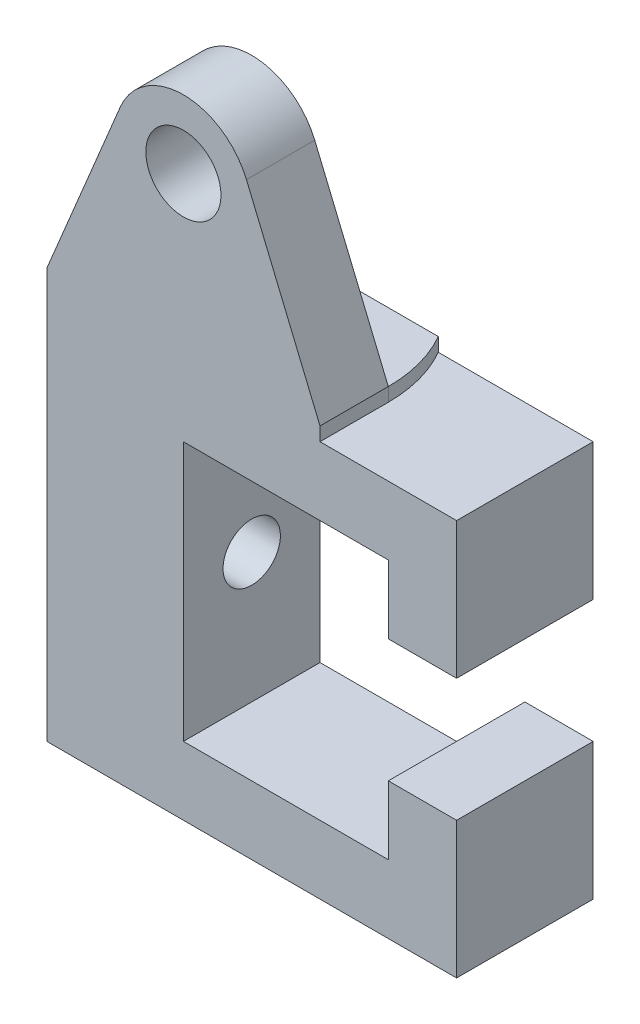
ISO-10303-21;
HEADER;
FILE_DESCRIPTION(('STEP AP214'),'2;1');
FILE_NAME('part.step','',(''),(''),'','','');
FILE_SCHEMA(('AUTOMOTIVE_DESIGN { 1 0 10303 214 1 1 1 1 }'));
ENDSEC;
DATA;
#1=APPLICATION_CONTEXT('core data for automotive mechanical design processes');
#2=APPLICATION_PROTOCOL_DEFINITION('international standard','automotive_design',2000,#1);
#3=PRODUCT_CONTEXT('',#1,'mechanical');
#4=PRODUCT('Part','Part','',(#3));
#5=PRODUCT_RELATED_PRODUCT_CATEGORY('part','',(#4));
#6=PRODUCT_DEFINITION_FORMATION('','',#4);
#7=PRODUCT_DEFINITION_CONTEXT('part definition',#1,'design');
#8=PRODUCT_DEFINITION('design','',#6,#7);
#9=PRODUCT_DEFINITION_SHAPE('','',#8);
#10=(LENGTH_UNIT() NAMED_UNIT(*) SI_UNIT(.MILLI.,.METRE.));
#11=(NAMED_UNIT(*) PLANE_ANGLE_UNIT() SI_UNIT($,.RADIAN.));
#12=(NAMED_UNIT(*) SI_UNIT($,.STERADIAN.) SOLID_ANGLE_UNIT());
#13=UNCERTAINTY_MEASURE_WITH_UNIT(LENGTH_MEASURE(1.E-05),#10,'distance_accuracy_value','');
#14=(GEOMETRIC_REPRESENTATION_CONTEXT(3) GLOBAL_UNCERTAINTY_ASSIGNED_CONTEXT((#13)) GLOBAL_UNIT_ASSIGNED_CONTEXT((#10,
#11,#12)) REPRESENTATION_CONTEXT('',''));
#15=CARTESIAN_POINT('',(0.,0.,0.));
#16=DIRECTION('',(0.,0.,1.));
#17=DIRECTION('',(1.,0.,0.));
#18=AXIS2_PLACEMENT_3D('',#15,#16,#17);
#19=CARTESIAN_POINT('',(0.,25.,0.));
#20=DIRECTION('',(0.,-1.,0.));
#21=DIRECTION('',(1.,0.,0.));
#22=AXIS2_PLACEMENT_3D('',#19,#20,#21);
#23=CYLINDRICAL_SURFACE('',#22,10.);
#24=DIRECTION('',(0.,1.,0.));
#25=VECTOR('',#24,1.);
#26=CARTESIAN_POINT('',(-10.,24.,0.));
#27=LINE('',#26,#25);
#28=CARTESIAN_POINT('',(-10.,24.,0.));
#29=VERTEX_POINT('',#28);
#30=CARTESIAN_POINT('',(-10.,25.,0.));
#31=VERTEX_POINT('',#30);
#32=EDGE_CURVE('E200',#29,#31,#27,.T.);
#33=ORIENTED_EDGE('',*,*,#32,.T.);
#34=CARTESIAN_POINT('',(0.,25.,0.));
#35=DIRECTION('',(0.,1.,0.));
#36=DIRECTION('',(-1.,0.,0.));
#37=AXIS2_PLACEMENT_3D('',#34,#35,#36);
#38=CIRCLE('',#37,10.);
#39=CARTESIAN_POINT('',(-8.66025403784439,25.,-5.));
#40=VERTEX_POINT('',#39);
#41=EDGE_CURVE('E192',#40,#31,#38,.T.);
#42=ORIENTED_EDGE('',*,*,#41,.F.);
#43=DIRECTION('',(0.,-1.,0.));
#44=VECTOR('',#43,1.);
#45=CARTESIAN_POINT('',(-8.66025403784439,25.,-5.));
#46=LINE('',#45,#44);
#47=CARTESIAN_POINT('',(-8.66025403784439,24.,-5.));
#48=VERTEX_POINT('',#47);
#49=EDGE_CURVE('E43',#48,#40,#46,.F.);
#50=ORIENTED_EDGE('',*,*,#49,.F.);
#51=CARTESIAN_POINT('',(0.,24.,0.));
#52=DIRECTION('',(0.,1.,0.));
#53=DIRECTION('',(-1.,0.,0.));
#54=AXIS2_PLACEMENT_3D('',#51,#52,#53);
#55=CIRCLE('',#54,10.);
#56=EDGE_CURVE('E201',#48,#29,#55,.T.);
#57=ORIENTED_EDGE('',*,*,#56,.T.);
#58=EDGE_LOOP('',(#33,#42,#50,#57));
#59=FACE_BOUND('',#58,.T.);
#60=ADVANCED_FACE('F35',(#59),#23,.T.);
#61=CARTESIAN_POINT('',(20.,24.,5.));
#62=DIRECTION('',(0.,-1.,0.));
#63=DIRECTION('',(1.,0.,0.));
#64=AXIS2_PLACEMENT_3D('',#61,#62,#63);
#65=PLANE('',#64);
#66=DIRECTION('',(0.,0.,1.));
#67=VECTOR('',#66,1.);
#68=CARTESIAN_POINT('',(9.99999999999999,24.,0.));
#69=LINE('',#68,#67);
#70=CARTESIAN_POINT('',(9.99999999999999,24.,0.));
#71=VERTEX_POINT('',#70);
#72=CARTESIAN_POINT('',(9.99999999999999,24.,5.));
#73=VERTEX_POINT('',#72);
#74=EDGE_CURVE('E203',#71,#73,#69,.T.);
#75=ORIENTED_EDGE('',*,*,#74,.T.);
#76=DIRECTION('',(-1.,0.,0.));
#77=VECTOR('',#76,1.);
#78=CARTESIAN_POINT('',(20.,24.,5.));
#79=LINE('',#78,#77);
#80=CARTESIAN_POINT('',(20.,24.,5.));
#81=VERTEX_POINT('',#80);
#82=EDGE_CURVE('E245',#81,#73,#79,.T.);
#83=ORIENTED_EDGE('',*,*,#82,.F.);
#84=DIRECTION('',(0.,0.,-1.));
#85=VECTOR('',#84,1.);
#86=CARTESIAN_POINT('',(20.,24.,5.));
#87=LINE('',#86,#85);
#88=CARTESIAN_POINT('',(20.,24.,-5.));
#89=VERTEX_POINT('',#88);
#90=EDGE_CURVE('E289',#81,#89,#87,.T.);
#91=ORIENTED_EDGE('',*,*,#90,.T.);
#92=DIRECTION('',(-1.,0.,0.));
#93=VECTOR('',#92,1.);
#94=CARTESIAN_POINT('',(20.,24.,-5.));
#95=LINE('',#94,#93);
#96=CARTESIAN_POINT('',(8.66025403784438,24.,-5.));
#97=VERTEX_POINT('',#96);
#98=EDGE_CURVE('E271',#89,#97,#95,.T.);
#99=ORIENTED_EDGE('',*,*,#98,.T.);
#100=EDGE_CURVE('E218',#71,#97,#55,.T.);
#101=ORIENTED_EDGE('',*,*,#100,.F.);
#102=EDGE_LOOP('',(#75,#83,#91,#99,#101));
#103=FACE_BOUND('',#102,.T.);
#104=ADVANCED_FACE('F359',(#103),#65,.F.);
#105=CARTESIAN_POINT('',(0.,25.,0.));
#106=DIRECTION('',(0.,1.,0.));
#107=DIRECTION('',(-1.,0.,0.));
#108=AXIS2_PLACEMENT_3D('',#105,#106,#107);
#109=PLANE('',#108);
#110=CARTESIAN_POINT('',(9.99999999999999,25.,0.));
#111=VERTEX_POINT('',#110);
#112=CARTESIAN_POINT('',(8.66025403784438,25.,-5.));
#113=VERTEX_POINT('',#112);
#114=EDGE_CURVE('E196',#111,#113,#38,.T.);
#115=ORIENTED_EDGE('',*,*,#114,.T.);
#116=DIRECTION('',(-1.,0.,0.));
#117=VECTOR('',#116,1.);
#118=CARTESIAN_POINT('',(0.,25.,-5.));
#119=LINE('',#118,#117);
#120=EDGE_CURVE('E195',#113,#40,#119,.T.);
#121=ORIENTED_EDGE('',*,*,#120,.T.);
#122=ORIENTED_EDGE('',*,*,#41,.T.);
#123=DIRECTION('',(1.,0.,0.));
#124=VECTOR('',#123,1.);
#125=CARTESIAN_POINT('',(9.99999999999999,25.,0.));
#126=LINE('',#125,#124);
#127=EDGE_CURVE('E167',#31,#111,#126,.T.);
#128=ORIENTED_EDGE('',*,*,#127,.T.);
#129=EDGE_LOOP('',(#115,#121,#122,#128));
#130=FACE_BOUND('',#129,.T.);
#131=ADVANCED_FACE('F194',(#130),#109,.T.);
#132=ORIENTED_EDGE('',*,*,#114,.F.);
#133=DIRECTION('',(0.,1.,0.));
#134=VECTOR('',#133,1.);
#135=CARTESIAN_POINT('',(9.99999999999999,24.,0.));
#136=LINE('',#135,#134);
#137=EDGE_CURVE('E50',#71,#111,#136,.T.);
#138=ORIENTED_EDGE('',*,*,#137,.F.);
#139=ORIENTED_EDGE('',*,*,#100,.T.);
#140=DIRECTION('',(0.,-1.,0.));
#141=VECTOR('',#140,1.);
#142=CARTESIAN_POINT('',(8.66025403784438,25.,-5.));
#143=LINE('',#142,#141);
#144=EDGE_CURVE('E11',#113,#97,#143,.T.);
#145=ORIENTED_EDGE('',*,*,#144,.F.);
#146=EDGE_LOOP('',(#132,#138,#139,#145));
#147=FACE_BOUND('',#146,.T.);
#148=ADVANCED_FACE('F371',(#147),#23,.T.);
#149=CARTESIAN_POINT('',(20.,5.,5.));
#150=DIRECTION('',(0.,-1.,0.));
#151=DIRECTION('',(0.,0.,-1.));
#152=AXIS2_PLACEMENT_3D('',#149,#150,#151);
#153=PLANE('',#152);
#154=DIRECTION('',(-1.,0.,0.));
#155=VECTOR('',#154,1.);
#156=CARTESIAN_POINT('',(20.,5.,-5.));
#157=LINE('',#156,#155);
#158=CARTESIAN_POINT('',(20.,5.,-5.));
#159=VERTEX_POINT('',#158);
#160=CARTESIAN_POINT('',(15.,5.,-5.));
#161=VERTEX_POINT('',#160);
#162=EDGE_CURVE('E223',#159,#161,#157,.T.);
#163=ORIENTED_EDGE('',*,*,#162,.T.);
#164=DIRECTION('',(0.,0.,-1.));
#165=VECTOR('',#164,1.);
#166=CARTESIAN_POINT('',(15.,5.,5.));
#167=LINE('',#166,#165);
#168=CARTESIAN_POINT('',(15.,5.,5.));
#169=VERTEX_POINT('',#168);
#170=EDGE_CURVE('E310',#169,#161,#167,.T.);
#171=ORIENTED_EDGE('',*,*,#170,.F.);
#172=DIRECTION('',(-1.,0.,0.));
#173=VECTOR('',#172,1.);
#174=CARTESIAN_POINT('',(20.,5.,5.));
#175=LINE('',#174,#173);
#176=CARTESIAN_POINT('',(20.,5.,5.));
#177=VERTEX_POINT('',#176);
#178=EDGE_CURVE('E227',#177,#169,#175,.T.);
#179=ORIENTED_EDGE('',*,*,#178,.F.);
#180=DIRECTION('',(0.,0.,-1.));
#181=VECTOR('',#180,1.);
#182=CARTESIAN_POINT('',(20.,5.,5.));
#183=LINE('',#182,#181);
#184=EDGE_CURVE('E253',#177,#159,#183,.T.);
#185=ORIENTED_EDGE('',*,*,#184,.T.);
#186=EDGE_LOOP('',(#163,#171,#179,#185));
#187=FACE_BOUND('',#186,.T.);
#188=ADVANCED_FACE('F37',(#187),#153,.F.);
#189=CARTESIAN_POINT('',(15.,5.,5.));
#190=DIRECTION('',(1.,0.,0.));
#191=DIRECTION('',(0.,1.,0.));
#192=AXIS2_PLACEMENT_3D('',#189,#190,#191);
#193=PLANE('',#192);
#194=DIRECTION('',(0.,-1.,0.));
#195=VECTOR('',#194,1.);
#196=CARTESIAN_POINT('',(15.,5.,-5.));
#197=LINE('',#196,#195);
#198=CARTESIAN_POINT('',(15.,0.,-5.));
#199=VERTEX_POINT('',#198);
#200=EDGE_CURVE('E256',#161,#199,#197,.T.);
#201=ORIENTED_EDGE('',*,*,#200,.T.);
#202=DIRECTION('',(0.,0.,-1.));
#203=VECTOR('',#202,1.);
#204=CARTESIAN_POINT('',(15.,0.,5.));
#205=LINE('',#204,#203);
#206=CARTESIAN_POINT('',(15.,0.,5.));
#207=VERTEX_POINT('',#206);
#208=EDGE_CURVE('E307',#207,#199,#205,.T.);
#209=ORIENTED_EDGE('',*,*,#208,.F.);
#210=DIRECTION('',(0.,-1.,0.));
#211=VECTOR('',#210,1.);
#212=CARTESIAN_POINT('',(15.,5.,5.));
#213=LINE('',#212,#211);
#214=EDGE_CURVE('E230',#169,#207,#213,.T.);
#215=ORIENTED_EDGE('',*,*,#214,.F.);
#216=ORIENTED_EDGE('',*,*,#170,.T.);
#217=EDGE_LOOP('',(#201,#209,#215,#216));
#218=FACE_BOUND('',#217,.T.);
#219=ADVANCED_FACE('F408',(#218),#193,.F.);
#220=CARTESIAN_POINT('',(15.,0.,5.));
#221=DIRECTION('',(0.,-1.,0.));
#222=DIRECTION('',(0.,0.,-1.));
#223=AXIS2_PLACEMENT_3D('',#220,#221,#222);
#224=PLANE('',#223);
#225=DIRECTION('',(-1.,0.,0.));
#226=VECTOR('',#225,1.);
#227=CARTESIAN_POINT('',(15.,0.,-5.));
#228=LINE('',#227,#226);
#229=CARTESIAN_POINT('',(0.,0.,-5.));
#230=VERTEX_POINT('',#229);
#231=EDGE_CURVE('E258',#199,#230,#228,.T.);
#232=ORIENTED_EDGE('',*,*,#231,.T.);
#233=DIRECTION('',(0.,0.,-1.));
#234=VECTOR('',#233,1.);
#235=CARTESIAN_POINT('',(0.,0.,5.));
#236=LINE('',#235,#234);
#237=CARTESIAN_POINT('',(0.,0.,5.));
#238=VERTEX_POINT('',#237);
#239=EDGE_CURVE('E304',#238,#230,#236,.T.);
#240=ORIENTED_EDGE('',*,*,#239,.F.);
#241=DIRECTION('',(-1.,0.,0.));
#242=VECTOR('',#241,1.);
#243=CARTESIAN_POINT('',(15.,0.,5.));
#244=LINE('',#243,#242);
#245=EDGE_CURVE('E233',#207,#238,#244,.T.);
#246=ORIENTED_EDGE('',*,*,#245,.F.);
#247=ORIENTED_EDGE('',*,*,#208,.T.);
#248=EDGE_LOOP('',(#232,#240,#246,#247));
#249=FACE_BOUND('',#248,.T.);
#250=ADVANCED_FACE('F454',(#249),#224,.F.);
#251=CARTESIAN_POINT('',(0.,0.,5.));
#252=DIRECTION('',(-1.,0.,0.));
#253=DIRECTION('',(0.,-1.,0.));
#254=AXIS2_PLACEMENT_3D('',#251,#252,#253);
#255=PLANE('',#254);
#256=CARTESIAN_POINT('',(0.,9.49999999999999,0.));
#257=DIRECTION('',(-1.,0.,0.));
#258=DIRECTION('',(0.,-1.,0.));
#259=AXIS2_PLACEMENT_3D('',#256,#257,#258);
#260=CIRCLE('',#259,2.1);
#261=CARTESIAN_POINT('',(0.,7.39999999999999,0.));
#262=VERTEX_POINT('',#261);
#263=EDGE_CURVE('E220',#262,#262,#260,.T.);
#264=ORIENTED_EDGE('',*,*,#263,.T.);
#265=EDGE_LOOP('',(#264));
#266=FACE_BOUND('',#265,.T.);
#267=DIRECTION('',(0.,1.,0.));
#268=VECTOR('',#267,1.);
#269=CARTESIAN_POINT('',(0.,0.,-5.));
#270=LINE('',#269,#268);
#271=CARTESIAN_POINT('',(0.,19.,-5.));
#272=VERTEX_POINT('',#271);
#273=EDGE_CURVE('E260',#230,#272,#270,.T.);
#274=ORIENTED_EDGE('',*,*,#273,.T.);
#275=DIRECTION('',(0.,0.,-1.));
#276=VECTOR('',#275,1.);
#277=CARTESIAN_POINT('',(0.,19.,5.));
#278=LINE('',#277,#276);
#279=CARTESIAN_POINT('',(0.,19.,5.));
#280=VERTEX_POINT('',#279);
#281=EDGE_CURVE('E301',#280,#272,#278,.T.);
#282=ORIENTED_EDGE('',*,*,#281,.F.);
#283=DIRECTION('',(0.,1.,0.));
#284=VECTOR('',#283,1.);
#285=CARTESIAN_POINT('',(0.,0.,5.));
#286=LINE('',#285,#284);
#287=EDGE_CURVE('E235',#238,#280,#286,.T.);
#288=ORIENTED_EDGE('',*,*,#287,.F.);
#289=ORIENTED_EDGE('',*,*,#239,.T.);
#290=EDGE_LOOP('',(#274,#282,#288,#289));
#291=FACE_BOUND('',#290,.T.);
#292=ADVANCED_FACE('F450',(#266,#291),#255,.F.);
#293=CARTESIAN_POINT('',(0.,19.,5.));
#294=DIRECTION('',(0.,1.,0.));
#295=DIRECTION('',(-1.,0.,0.));
#296=AXIS2_PLACEMENT_3D('',#293,#294,#295);
#297=PLANE('',#296);
#298=DIRECTION('',(1.,0.,0.));
#299=VECTOR('',#298,1.);
#300=CARTESIAN_POINT('',(0.,19.,-5.));
#301=LINE('',#300,#299);
#302=CARTESIAN_POINT('',(15.,19.,-5.));
#303=VERTEX_POINT('',#302);
#304=EDGE_CURVE('E262',#272,#303,#301,.T.);
#305=ORIENTED_EDGE('',*,*,#304,.T.);
#306=DIRECTION('',(0.,0.,-1.));
#307=VECTOR('',#306,1.);
#308=CARTESIAN_POINT('',(15.,19.,5.));
#309=LINE('',#308,#307);
#310=CARTESIAN_POINT('',(15.,19.,5.));
#311=VERTEX_POINT('',#310);
#312=EDGE_CURVE('E298',#311,#303,#309,.T.);
#313=ORIENTED_EDGE('',*,*,#312,.F.);
#314=DIRECTION('',(1.,0.,0.));
#315=VECTOR('',#314,1.);
#316=CARTESIAN_POINT('',(0.,19.,5.));
#317=LINE('',#316,#315);
#318=EDGE_CURVE('E237',#280,#311,#317,.T.);
#319=ORIENTED_EDGE('',*,*,#318,.F.);
#320=ORIENTED_EDGE('',*,*,#281,.T.);
#321=EDGE_LOOP('',(#305,#313,#319,#320));
#322=FACE_BOUND('',#321,.T.);
#323=ADVANCED_FACE('F446',(#322),#297,.F.);
#324=CARTESIAN_POINT('',(15.,19.,5.));
#325=DIRECTION('',(1.,0.,0.));
#326=DIRECTION('',(0.,1.,0.));
#327=AXIS2_PLACEMENT_3D('',#324,#325,#326);
#328=PLANE('',#327);
#329=DIRECTION('',(0.,-1.,0.));
#330=VECTOR('',#329,1.);
#331=CARTESIAN_POINT('',(15.,19.,-5.));
#332=LINE('',#331,#330);
#333=CARTESIAN_POINT('',(15.,14.,-5.));
#334=VERTEX_POINT('',#333);
#335=EDGE_CURVE('E264',#303,#334,#332,.T.);
#336=ORIENTED_EDGE('',*,*,#335,.T.);
#337=DIRECTION('',(0.,0.,-1.));
#338=VECTOR('',#337,1.);
#339=CARTESIAN_POINT('',(15.,14.,5.));
#340=LINE('',#339,#338);
#341=CARTESIAN_POINT('',(15.,14.,5.));
#342=VERTEX_POINT('',#341);
#343=EDGE_CURVE('E295',#342,#334,#340,.T.);
#344=ORIENTED_EDGE('',*,*,#343,.F.);
#345=DIRECTION('',(0.,-1.,0.));
#346=VECTOR('',#345,1.);
#347=CARTESIAN_POINT('',(15.,19.,5.));
#348=LINE('',#347,#346);
#349=EDGE_CURVE('E239',#311,#342,#348,.T.);
#350=ORIENTED_EDGE('',*,*,#349,.F.);
#351=ORIENTED_EDGE('',*,*,#312,.T.);
#352=EDGE_LOOP('',(#336,#344,#350,#351));
#353=FACE_BOUND('',#352,.T.);
#354=ADVANCED_FACE('F442',(#353),#328,.F.);
#355=CARTESIAN_POINT('',(15.,14.,5.));
#356=DIRECTION('',(0.,1.,0.));
#357=DIRECTION('',(0.,0.,1.));
#358=AXIS2_PLACEMENT_3D('',#355,#356,#357);
#359=PLANE('',#358);
#360=DIRECTION('',(1.,0.,0.));
#361=VECTOR('',#360,1.);
#362=CARTESIAN_POINT('',(15.,14.,-5.));
#363=LINE('',#362,#361);
#364=CARTESIAN_POINT('',(20.,14.,-5.));
#365=VERTEX_POINT('',#364);
#366=EDGE_CURVE('E266',#334,#365,#363,.T.);
#367=ORIENTED_EDGE('',*,*,#366,.T.);
#368=DIRECTION('',(0.,0.,-1.));
#369=VECTOR('',#368,1.);
#370=CARTESIAN_POINT('',(20.,14.,5.));
#371=LINE('',#370,#369);
#372=CARTESIAN_POINT('',(20.,14.,5.));
#373=VERTEX_POINT('',#372);
#374=EDGE_CURVE('E292',#373,#365,#371,.T.);
#375=ORIENTED_EDGE('',*,*,#374,.F.);
#376=DIRECTION('',(1.,0.,0.));
#377=VECTOR('',#376,1.);
#378=CARTESIAN_POINT('',(15.,14.,5.));
#379=LINE('',#378,#377);
#380=EDGE_CURVE('E241',#342,#373,#379,.T.);
#381=ORIENTED_EDGE('',*,*,#380,.F.);
#382=ORIENTED_EDGE('',*,*,#343,.T.);
#383=EDGE_LOOP('',(#367,#375,#381,#382));
#384=FACE_BOUND('',#383,.T.);
#385=ADVANCED_FACE('F439',(#384),#359,.F.);
#386=CARTESIAN_POINT('',(20.,14.,5.));
#387=DIRECTION('',(-1.,0.,0.));
#388=DIRECTION('',(0.,0.,1.));
#389=AXIS2_PLACEMENT_3D('',#386,#387,#388);
#390=PLANE('',#389);
#391=DIRECTION('',(0.,1.,0.));
#392=VECTOR('',#391,1.);
#393=CARTESIAN_POINT('',(20.,14.,-5.));
#394=LINE('',#393,#392);
#395=EDGE_CURVE('E268',#365,#89,#394,.T.);
#396=ORIENTED_EDGE('',*,*,#395,.T.);
#397=ORIENTED_EDGE('',*,*,#90,.F.);
#398=DIRECTION('',(0.,1.,0.));
#399=VECTOR('',#398,1.);
#400=CARTESIAN_POINT('',(20.,14.,5.));
#401=LINE('',#400,#399);
#402=EDGE_CURVE('E243',#373,#81,#401,.T.);
#403=ORIENTED_EDGE('',*,*,#402,.F.);
#404=ORIENTED_EDGE('',*,*,#374,.T.);
#405=EDGE_LOOP('',(#396,#397,#403,#404));
#406=FACE_BOUND('',#405,.T.);
#407=ADVANCED_FACE('F366',(#406),#390,.F.);
#408=ORIENTED_EDGE('',*,*,#56,.F.);
#409=CARTESIAN_POINT('',(-10.,24.,-5.));
#410=VERTEX_POINT('',#409);
#411=EDGE_CURVE('E270',#48,#410,#95,.T.);
#412=ORIENTED_EDGE('',*,*,#411,.T.);
#413=DIRECTION('',(0.,0.,-1.));
#414=VECTOR('',#413,1.);
#415=CARTESIAN_POINT('',(-10.,24.,5.));
#416=LINE('',#415,#414);
#417=EDGE_CURVE('E287',#29,#410,#416,.T.);
#418=ORIENTED_EDGE('',*,*,#417,.F.);
#419=EDGE_LOOP('',(#408,#412,#418));
#420=FACE_BOUND('',#419,.T.);
#421=ADVANCED_FACE('F321',(#420),#65,.F.);
#422=CARTESIAN_POINT('',(-10.,24.,5.));
#423=DIRECTION('',(1.,0.,0.));
#424=DIRECTION('',(0.,1.,0.));
#425=AXIS2_PLACEMENT_3D('',#422,#423,#424);
#426=PLANE('',#425);
#427=CARTESIAN_POINT('',(-10.,9.49999999999999,0.));
#428=DIRECTION('',(-1.,0.,0.));
#429=DIRECTION('',(0.,-1.,0.));
#430=AXIS2_PLACEMENT_3D('',#427,#428,#429);
#431=CIRCLE('',#430,2.1);
#432=CARTESIAN_POINT('',(-10.,7.39999999999999,0.));
#433=VERTEX_POINT('',#432);
#434=EDGE_CURVE('E224',#433,#433,#431,.T.);
#435=ORIENTED_EDGE('',*,*,#434,.F.);
#436=EDGE_LOOP('',(#435));
#437=FACE_BOUND('',#436,.T.);
#438=DIRECTION('',(0.,-1.,0.));
#439=VECTOR('',#438,1.);
#440=CARTESIAN_POINT('',(-10.,24.,-5.));
#441=LINE('',#440,#439);
#442=CARTESIAN_POINT('',(-10.,-5.,-5.));
#443=VERTEX_POINT('',#442);
#444=EDGE_CURVE('E274',#410,#443,#441,.T.);
#445=ORIENTED_EDGE('',*,*,#444,.T.);
#446=DIRECTION('',(0.,0.,-1.));
#447=VECTOR('',#446,1.);
#448=CARTESIAN_POINT('',(-10.,-5.,5.));
#449=LINE('',#448,#447);
#450=CARTESIAN_POINT('',(-10.,-5.,5.));
#451=VERTEX_POINT('',#450);
#452=EDGE_CURVE('E284',#451,#443,#449,.T.);
#453=ORIENTED_EDGE('',*,*,#452,.F.);
#454=DIRECTION('',(0.,-1.,0.));
#455=VECTOR('',#454,1.);
#456=CARTESIAN_POINT('',(-10.,24.,5.));
#457=LINE('',#456,#455);
#458=CARTESIAN_POINT('',(-10.,25.,5.));
#459=VERTEX_POINT('',#458);
#460=EDGE_CURVE('E207',#459,#451,#457,.T.);
#461=ORIENTED_EDGE('',*,*,#460,.F.);
#462=DIRECTION('',(0.,0.,-1.));
#463=VECTOR('',#462,1.);
#464=CARTESIAN_POINT('',(-10.,25.,5.));
#465=LINE('',#464,#463);
#466=EDGE_CURVE('E186',#459,#31,#465,.T.);
#467=ORIENTED_EDGE('',*,*,#466,.T.);
#468=ORIENTED_EDGE('',*,*,#32,.F.);
#469=ORIENTED_EDGE('',*,*,#417,.T.);
#470=EDGE_LOOP('',(#445,#453,#461,#467,#468,#469));
#471=FACE_BOUND('',#470,.T.);
#472=ADVANCED_FACE('F205',(#437,#471),#426,.F.);
#473=CARTESIAN_POINT('',(-10.,-5.,5.));
#474=DIRECTION('',(0.,1.,0.));
#475=DIRECTION('',(0.,0.,1.));
#476=AXIS2_PLACEMENT_3D('',#473,#474,#475);
#477=PLANE('',#476);
#478=DIRECTION('',(1.,0.,0.));
#479=VECTOR('',#478,1.);
#480=CARTESIAN_POINT('',(-10.,-5.,-5.));
#481=LINE('',#480,#479);
#482=CARTESIAN_POINT('',(20.,-5.,-5.));
#483=VERTEX_POINT('',#482);
#484=EDGE_CURVE('E276',#443,#483,#481,.T.);
#485=ORIENTED_EDGE('',*,*,#484,.T.);
#486=DIRECTION('',(0.,0.,-1.));
#487=VECTOR('',#486,1.);
#488=CARTESIAN_POINT('',(20.,-5.,5.));
#489=LINE('',#488,#487);
#490=CARTESIAN_POINT('',(20.,-5.,5.));
#491=VERTEX_POINT('',#490);
#492=EDGE_CURVE('E281',#491,#483,#489,.T.);
#493=ORIENTED_EDGE('',*,*,#492,.F.);
#494=DIRECTION('',(1.,0.,0.));
#495=VECTOR('',#494,1.);
#496=CARTESIAN_POINT('',(-10.,-5.,5.));
#497=LINE('',#496,#495);
#498=EDGE_CURVE('E249',#451,#491,#497,.T.);
#499=ORIENTED_EDGE('',*,*,#498,.F.);
#500=ORIENTED_EDGE('',*,*,#452,.T.);
#501=EDGE_LOOP('',(#485,#493,#499,#500));
#502=FACE_BOUND('',#501,.T.);
#503=ADVANCED_FACE('F324',(#502),#477,.F.);
#504=CARTESIAN_POINT('',(20.,-5.,5.));
#505=DIRECTION('',(-1.,0.,0.));
#506=DIRECTION('',(0.,0.,1.));
#507=AXIS2_PLACEMENT_3D('',#504,#505,#506);
#508=PLANE('',#507);
#509=DIRECTION('',(0.,1.,0.));
#510=VECTOR('',#509,1.);
#511=CARTESIAN_POINT('',(20.,-5.,-5.));
#512=LINE('',#511,#510);
#513=EDGE_CURVE('E231',#483,#159,#512,.T.);
#514=ORIENTED_EDGE('',*,*,#513,.T.);
#515=ORIENTED_EDGE('',*,*,#184,.F.);
#516=DIRECTION('',(0.,1.,0.));
#517=VECTOR('',#516,1.);
#518=CARTESIAN_POINT('',(20.,-5.,5.));
#519=LINE('',#518,#517);
#520=EDGE_CURVE('E251',#491,#177,#519,.T.);
#521=ORIENTED_EDGE('',*,*,#520,.F.);
#522=ORIENTED_EDGE('',*,*,#492,.T.);
#523=EDGE_LOOP('',(#514,#515,#521,#522));
#524=FACE_BOUND('',#523,.T.);
#525=ADVANCED_FACE('F329',(#524),#508,.F.);
#526=CARTESIAN_POINT('',(0.,0.,5.));
#527=DIRECTION('',(0.,0.,1.));
#528=DIRECTION('',(1.,0.,0.));
#529=AXIS2_PLACEMENT_3D('',#526,#527,#528);
#530=PLANE('',#529);
#531=DIRECTION('',(-0.384615384615385,-0.923076923076923,0.));
#532=VECTOR('',#531,1.);
#533=CARTESIAN_POINT('',(-10.,25.,5.));
#534=LINE('',#533,#532);
#535=CARTESIAN_POINT('',(-4.61538461538461,37.9230769230769,5.));
#536=VERTEX_POINT('',#535);
#537=EDGE_CURVE('E213',#536,#459,#534,.T.);
#538=ORIENTED_EDGE('',*,*,#537,.T.);
#539=ORIENTED_EDGE('',*,*,#460,.T.);
#540=ORIENTED_EDGE('',*,*,#498,.T.);
#541=ORIENTED_EDGE('',*,*,#520,.T.);
#542=ORIENTED_EDGE('',*,*,#178,.T.);
#543=ORIENTED_EDGE('',*,*,#214,.T.);
#544=ORIENTED_EDGE('',*,*,#245,.T.);
#545=ORIENTED_EDGE('',*,*,#287,.T.);
#546=ORIENTED_EDGE('',*,*,#318,.T.);
#547=ORIENTED_EDGE('',*,*,#349,.T.);
#548=ORIENTED_EDGE('',*,*,#380,.T.);
#549=ORIENTED_EDGE('',*,*,#402,.T.);
#550=ORIENTED_EDGE('',*,*,#82,.T.);
#551=DIRECTION('',(0.,1.,0.));
#552=VECTOR('',#551,1.);
#553=CARTESIAN_POINT('',(9.99999999999999,24.,5.));
#554=LINE('',#553,#552);
#555=CARTESIAN_POINT('',(9.99999999999999,25.,5.));
#556=VERTEX_POINT('',#555);
#557=EDGE_CURVE('E353',#73,#556,#554,.T.);
#558=ORIENTED_EDGE('',*,*,#557,.T.);
#559=DIRECTION('',(-0.384615384615384,0.923076923076923,0.));
#560=VECTOR('',#559,1.);
#561=CARTESIAN_POINT('',(9.99999999999999,25.,5.));
#562=LINE('',#561,#560);
#563=CARTESIAN_POINT('',(4.61538461538461,37.9230769230769,5.));
#564=VERTEX_POINT('',#563);
#565=EDGE_CURVE('E178',#556,#564,#562,.T.);
#566=ORIENTED_EDGE('',*,*,#565,.T.);
#567=CARTESIAN_POINT('',(0.,36.,5.));
#568=DIRECTION('',(0.,0.,1.));
#569=DIRECTION('',(1.,0.,0.));
#570=AXIS2_PLACEMENT_3D('',#567,#568,#569);
#571=CIRCLE('',#570,5.);
#572=EDGE_CURVE('E339',#564,#536,#571,.T.);
#573=ORIENTED_EDGE('',*,*,#572,.T.);
#574=EDGE_LOOP('',(#538,#539,#540,#541,#542,#543,#544,#545,#546,#547,#548,#549,#550,#558,#566,#573));
#575=FACE_BOUND('',#574,.T.);
#576=CARTESIAN_POINT('',(0.,36.,5.));
#577=DIRECTION('',(0.,0.,1.));
#578=DIRECTION('',(1.,0.,0.));
#579=AXIS2_PLACEMENT_3D('',#576,#577,#578);
#580=CIRCLE('',#579,2.75);
#581=CARTESIAN_POINT('',(2.75,36.,5.));
#582=VERTEX_POINT('',#581);
#583=EDGE_CURVE('E345',#582,#582,#580,.T.);
#584=ORIENTED_EDGE('',*,*,#583,.F.);
#585=EDGE_LOOP('',(#584));
#586=FACE_BOUND('',#585,.T.);
#587=ADVANCED_FACE('F335',(#575,#586),#530,.T.);
#588=CARTESIAN_POINT('',(0.,0.,-5.));
#589=DIRECTION('',(0.,0.,1.));
#590=DIRECTION('',(1.,0.,0.));
#591=AXIS2_PLACEMENT_3D('',#588,#589,#590);
#592=PLANE('',#591);
#593=ORIENTED_EDGE('',*,*,#162,.F.);
#594=ORIENTED_EDGE('',*,*,#513,.F.);
#595=ORIENTED_EDGE('',*,*,#484,.F.);
#596=ORIENTED_EDGE('',*,*,#444,.F.);
#597=ORIENTED_EDGE('',*,*,#411,.F.);
#598=ORIENTED_EDGE('',*,*,#49,.T.);
#599=ORIENTED_EDGE('',*,*,#120,.F.);
#600=ORIENTED_EDGE('',*,*,#144,.T.);
#601=ORIENTED_EDGE('',*,*,#98,.F.);
#602=ORIENTED_EDGE('',*,*,#395,.F.);
#603=ORIENTED_EDGE('',*,*,#366,.F.);
#604=ORIENTED_EDGE('',*,*,#335,.F.);
#605=ORIENTED_EDGE('',*,*,#304,.F.);
#606=ORIENTED_EDGE('',*,*,#273,.F.);
#607=ORIENTED_EDGE('',*,*,#231,.F.);
#608=ORIENTED_EDGE('',*,*,#200,.F.);
#609=EDGE_LOOP('',(#593,#594,#595,#596,#597,#598,#599,#600,#601,#602,#603,#604,#605,#606,#607,#608));
#610=FACE_BOUND('',#609,.T.);
#611=ADVANCED_FACE('F315',(#610),#592,.F.);
#612=CARTESIAN_POINT('',(0.,9.49999999999999,0.));
#613=DIRECTION('',(-1.,0.,0.));
#614=DIRECTION('',(0.,-1.,0.));
#615=AXIS2_PLACEMENT_3D('',#612,#613,#614);
#616=CYLINDRICAL_SURFACE('',#615,2.1);
#617=ORIENTED_EDGE('',*,*,#263,.F.);
#618=EDGE_LOOP('',(#617));
#619=FACE_BOUND('',#618,.T.);
#620=ORIENTED_EDGE('',*,*,#434,.T.);
#621=EDGE_LOOP('',(#620));
#622=FACE_BOUND('',#621,.T.);
#623=ADVANCED_FACE('F415',(#619,#622),#616,.F.);
#624=CARTESIAN_POINT('',(0.,36.,0.));
#625=DIRECTION('',(0.,0.,1.));
#626=DIRECTION('',(1.,0.,0.));
#627=AXIS2_PLACEMENT_3D('',#624,#625,#626);
#628=PLANE('',#627);
#629=DIRECTION('',(-0.384615384615384,0.923076923076923,0.));
#630=VECTOR('',#629,1.);
#631=CARTESIAN_POINT('',(9.99999999999999,25.,0.));
#632=LINE('',#631,#630);
#633=CARTESIAN_POINT('',(4.61538461538461,37.9230769230769,0.));
#634=VERTEX_POINT('',#633);
#635=EDGE_CURVE('E173',#111,#634,#632,.T.);
#636=ORIENTED_EDGE('',*,*,#635,.F.);
#637=ORIENTED_EDGE('',*,*,#127,.F.);
#638=DIRECTION('',(-0.384615384615385,-0.923076923076923,0.));
#639=VECTOR('',#638,1.);
#640=CARTESIAN_POINT('',(-10.,25.,0.));
#641=LINE('',#640,#639);
#642=CARTESIAN_POINT('',(-4.61538461538461,37.9230769230769,0.));
#643=VERTEX_POINT('',#642);
#644=EDGE_CURVE('E171',#643,#31,#641,.T.);
#645=ORIENTED_EDGE('',*,*,#644,.F.);
#646=CARTESIAN_POINT('',(0.,36.,0.));
#647=DIRECTION('',(0.,0.,1.));
#648=DIRECTION('',(1.,0.,0.));
#649=AXIS2_PLACEMENT_3D('',#646,#647,#648);
#650=CIRCLE('',#649,5.);
#651=EDGE_CURVE('E189',#634,#643,#650,.T.);
#652=ORIENTED_EDGE('',*,*,#651,.F.);
#653=EDGE_LOOP('',(#636,#637,#645,#652));
#654=FACE_BOUND('',#653,.T.);
#655=CARTESIAN_POINT('',(0.,36.,0.));
#656=DIRECTION('',(0.,0.,1.));
#657=DIRECTION('',(1.,0.,0.));
#658=AXIS2_PLACEMENT_3D('',#655,#656,#657);
#659=CIRCLE('',#658,2.75);
#660=CARTESIAN_POINT('',(2.75,36.,0.));
#661=VERTEX_POINT('',#660);
#662=EDGE_CURVE('E375',#661,#661,#659,.T.);
#663=ORIENTED_EDGE('',*,*,#662,.T.);
#664=EDGE_LOOP('',(#663));
#665=FACE_BOUND('',#664,.T.);
#666=ADVANCED_FACE('F169',(#654,#665),#628,.F.);
#667=CARTESIAN_POINT('',(9.99999999999999,25.,5.));
#668=DIRECTION('',(-0.923076923076923,-0.384615384615384,0.));
#669=DIRECTION('',(0.384615384615384,-0.923076923076923,0.));
#670=AXIS2_PLACEMENT_3D('',#667,#668,#669);
#671=PLANE('',#670);
#672=ORIENTED_EDGE('',*,*,#635,.T.);
#673=DIRECTION('',(0.,0.,-1.));
#674=VECTOR('',#673,1.);
#675=CARTESIAN_POINT('',(4.61538461538461,37.9230769230769,5.));
#676=LINE('',#675,#674);
#677=EDGE_CURVE('E197',#564,#634,#676,.T.);
#678=ORIENTED_EDGE('',*,*,#677,.F.);
#679=ORIENTED_EDGE('',*,*,#565,.F.);
#680=DIRECTION('',(0.,0.,-1.));
#681=VECTOR('',#680,1.);
#682=CARTESIAN_POINT('',(9.99999999999999,25.,5.));
#683=LINE('',#682,#681);
#684=EDGE_CURVE('E209',#556,#111,#683,.T.);
#685=ORIENTED_EDGE('',*,*,#684,.T.);
#686=EDGE_LOOP('',(#672,#678,#679,#685));
#687=FACE_BOUND('',#686,.T.);
#688=ADVANCED_FACE('F351',(#687),#671,.F.);
#689=CARTESIAN_POINT('',(0.,36.,5.));
#690=DIRECTION('',(0.,0.,-1.));
#691=DIRECTION('',(-1.,0.,0.));
#692=AXIS2_PLACEMENT_3D('',#689,#690,#691);
#693=CYLINDRICAL_SURFACE('',#692,5.);
#694=ORIENTED_EDGE('',*,*,#651,.T.);
#695=DIRECTION('',(0.,0.,-1.));
#696=VECTOR('',#695,1.);
#697=CARTESIAN_POINT('',(-4.61538461538461,37.9230769230769,5.));
#698=LINE('',#697,#696);
#699=EDGE_CURVE('E188',#536,#643,#698,.T.);
#700=ORIENTED_EDGE('',*,*,#699,.F.);
#701=ORIENTED_EDGE('',*,*,#572,.F.);
#702=ORIENTED_EDGE('',*,*,#677,.T.);
#703=EDGE_LOOP('',(#694,#700,#701,#702));
#704=FACE_BOUND('',#703,.T.);
#705=ADVANCED_FACE('F347',(#704),#693,.T.);
#706=CARTESIAN_POINT('',(-10.,25.,5.));
#707=DIRECTION('',(0.923076923076923,-0.384615384615385,0.));
#708=DIRECTION('',(0.384615384615385,0.923076923076923,0.));
#709=AXIS2_PLACEMENT_3D('',#706,#707,#708);
#710=PLANE('',#709);
#711=ORIENTED_EDGE('',*,*,#644,.T.);
#712=ORIENTED_EDGE('',*,*,#466,.F.);
#713=ORIENTED_EDGE('',*,*,#537,.F.);
#714=ORIENTED_EDGE('',*,*,#699,.T.);
#715=EDGE_LOOP('',(#711,#712,#713,#714));
#716=FACE_BOUND('',#715,.T.);
#717=ADVANCED_FACE('F183',(#716),#710,.F.);
#718=CARTESIAN_POINT('',(0.,36.,5.));
#719=DIRECTION('',(0.,0.,-1.));
#720=DIRECTION('',(-1.,0.,0.));
#721=AXIS2_PLACEMENT_3D('',#718,#719,#720);
#722=CYLINDRICAL_SURFACE('',#721,2.75);
#723=ORIENTED_EDGE('',*,*,#583,.T.);
#724=EDGE_LOOP('',(#723));
#725=FACE_BOUND('',#724,.T.);
#726=ORIENTED_EDGE('',*,*,#662,.F.);
#727=EDGE_LOOP('',(#726));
#728=FACE_BOUND('',#727,.T.);
#729=ADVANCED_FACE('F381',(#725,#728),#722,.F.);
#730=CARTESIAN_POINT('',(9.99999999999999,24.,0.));
#731=DIRECTION('',(-1.,0.,0.));
#732=DIRECTION('',(0.,0.,1.));
#733=AXIS2_PLACEMENT_3D('',#730,#731,#732);
#734=PLANE('',#733);
#735=ORIENTED_EDGE('',*,*,#684,.F.);
#736=ORIENTED_EDGE('',*,*,#557,.F.);
#737=ORIENTED_EDGE('',*,*,#74,.F.);
#738=ORIENTED_EDGE('',*,*,#137,.T.);
#739=EDGE_LOOP('',(#735,#736,#737,#738));
#740=FACE_BOUND('',#739,.T.);
#741=ADVANCED_FACE('F352',(#740),#734,.F.);
#742=CLOSED_SHELL('',(#60,#104,#131,#148,#188,#219,#250,#292,#323,#354,#385,#407,#421,#472,#503,
#525,#587,#611,#623,#666,#688,#705,#717,#729,#741));
#743=MANIFOLD_SOLID_BREP('B2',#742);
#744=ADVANCED_BREP_SHAPE_REPRESENTATION('',(#18,#743),#14);
#745=SHAPE_DEFINITION_REPRESENTATION(#9,#744);
ENDSEC;
END-ISO-10303-21;
